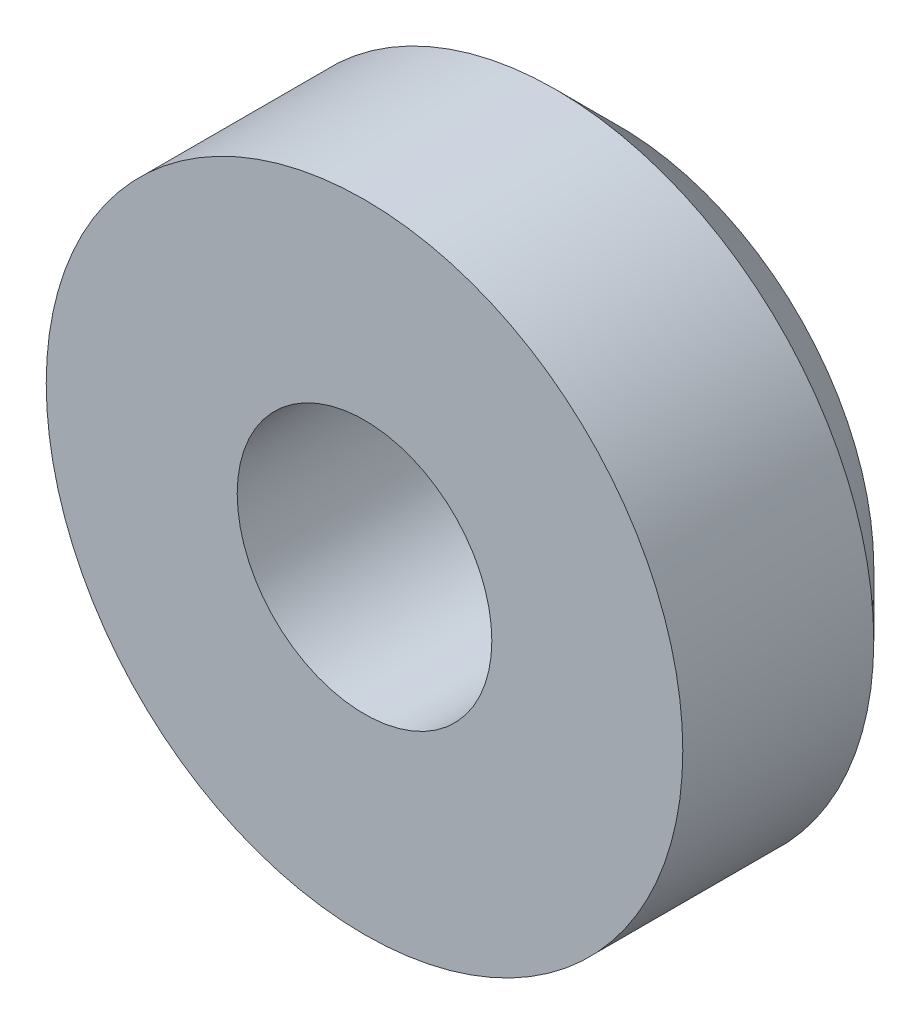
ISO-10303-21;
HEADER;
FILE_DESCRIPTION(('STEP AP214'),'2;1');
FILE_NAME('part.step','',(''),(''),'','','');
FILE_SCHEMA(('AUTOMOTIVE_DESIGN { 1 0 10303 214 1 1 1 1 }'));
ENDSEC;
DATA;
#1=APPLICATION_CONTEXT('core data for automotive mechanical design processes');
#2=APPLICATION_PROTOCOL_DEFINITION('international standard','automotive_design',2000,#1);
#3=PRODUCT_CONTEXT('',#1,'mechanical');
#4=PRODUCT('Part','Part','',(#3));
#5=PRODUCT_RELATED_PRODUCT_CATEGORY('part','',(#4));
#6=PRODUCT_DEFINITION_FORMATION('','',#4);
#7=PRODUCT_DEFINITION_CONTEXT('part definition',#1,'design');
#8=PRODUCT_DEFINITION('design','',#6,#7);
#9=PRODUCT_DEFINITION_SHAPE('','',#8);
#10=(LENGTH_UNIT() NAMED_UNIT(*) SI_UNIT(.MILLI.,.METRE.));
#11=(NAMED_UNIT(*) PLANE_ANGLE_UNIT() SI_UNIT($,.RADIAN.));
#12=(NAMED_UNIT(*) SI_UNIT($,.STERADIAN.) SOLID_ANGLE_UNIT());
#13=UNCERTAINTY_MEASURE_WITH_UNIT(LENGTH_MEASURE(1.E-05),#10,'distance_accuracy_value','');
#14=(GEOMETRIC_REPRESENTATION_CONTEXT(3) GLOBAL_UNCERTAINTY_ASSIGNED_CONTEXT((#13)) GLOBAL_UNIT_ASSIGNED_CONTEXT((#10,
#11,#12)) REPRESENTATION_CONTEXT('',''));
#15=CARTESIAN_POINT('',(0.,0.,0.));
#16=DIRECTION('',(0.,0.,1.));
#17=DIRECTION('',(1.,0.,0.));
#18=AXIS2_PLACEMENT_3D('',#15,#16,#17);
#19=CARTESIAN_POINT('',(0.,0.,2.));
#20=DIRECTION('',(0.,0.,-1.));
#21=DIRECTION('',(-1.,0.,0.));
#22=AXIS2_PLACEMENT_3D('',#19,#20,#21);
#23=CYLINDRICAL_SURFACE('',#22,15.);
#24=CARTESIAN_POINT('',(0.,0.,3.));
#25=DIRECTION('',(0.,0.,1.));
#26=DIRECTION('',(1.,0.,0.));
#27=AXIS2_PLACEMENT_3D('',#24,#25,#26);
#28=CIRCLE('',#27,15.);
#29=CARTESIAN_POINT('',(15.,0.,3.));
#30=VERTEX_POINT('',#29);
#31=EDGE_CURVE('E41',#30,#30,#28,.T.);
#32=ORIENTED_EDGE('',*,*,#31,.T.);
#33=EDGE_LOOP('',(#32));
#34=FACE_BOUND('',#33,.T.);
#35=CARTESIAN_POINT('',(0.,0.,12.));
#36=DIRECTION('',(0.,0.,1.));
#37=DIRECTION('',(1.,0.,0.));
#38=AXIS2_PLACEMENT_3D('',#35,#36,#37);
#39=CIRCLE('',#38,15.);
#40=CARTESIAN_POINT('',(15.,0.,12.));
#41=VERTEX_POINT('',#40);
#42=EDGE_CURVE('E49',#41,#41,#39,.T.);
#43=ORIENTED_EDGE('',*,*,#42,.F.);
#44=EDGE_LOOP('',(#43));
#45=FACE_BOUND('',#44,.T.);
#46=ADVANCED_FACE('F33',(#34,#45),#23,.T.);
#47=CARTESIAN_POINT('',(0.,0.,0.));
#48=DIRECTION('',(0.,0.,1.));
#49=DIRECTION('',(1.,0.,0.));
#50=AXIS2_PLACEMENT_3D('',#47,#48,#49);
#51=PLANE('',#50);
#52=CARTESIAN_POINT('',(0.,0.,0.));
#53=DIRECTION('',(0.,0.,1.));
#54=DIRECTION('',(1.,0.,0.));
#55=AXIS2_PLACEMENT_3D('',#52,#53,#54);
#56=CIRCLE('',#55,12.);
#57=CARTESIAN_POINT('',(12.,0.,0.));
#58=VERTEX_POINT('',#57);
#59=EDGE_CURVE('E10',#58,#58,#56,.F.);
#60=ORIENTED_EDGE('',*,*,#59,.T.);
#61=EDGE_LOOP('',(#60));
#62=FACE_BOUND('',#61,.T.);
#63=ADVANCED_FACE('F63',(#62),#51,.F.);
#64=CARTESIAN_POINT('',(0.,0.,12.));
#65=DIRECTION('',(0.,0.,1.));
#66=DIRECTION('',(1.,0.,0.));
#67=AXIS2_PLACEMENT_3D('',#64,#65,#66);
#68=PLANE('',#67);
#69=ORIENTED_EDGE('',*,*,#42,.T.);
#70=EDGE_LOOP('',(#69));
#71=FACE_BOUND('',#70,.T.);
#72=CARTESIAN_POINT('',(0.,0.,12.));
#73=DIRECTION('',(0.,0.,1.));
#74=DIRECTION('',(1.,0.,0.));
#75=AXIS2_PLACEMENT_3D('',#72,#73,#74);
#76=CIRCLE('',#75,6.);
#77=CARTESIAN_POINT('',(6.,0.,12.));
#78=VERTEX_POINT('',#77);
#79=EDGE_CURVE('E54',#78,#78,#76,.T.);
#80=ORIENTED_EDGE('',*,*,#79,.F.);
#81=EDGE_LOOP('',(#80));
#82=FACE_BOUND('',#81,.T.);
#83=ADVANCED_FACE('F61',(#71,#82),#68,.T.);
#84=CARTESIAN_POINT('',(0.,0.,12.));
#85=DIRECTION('',(0.,0.,-1.));
#86=DIRECTION('',(-1.,0.,0.));
#87=AXIS2_PLACEMENT_3D('',#84,#85,#86);
#88=CYLINDRICAL_SURFACE('',#87,6.);
#89=ORIENTED_EDGE('',*,*,#79,.T.);
#90=EDGE_LOOP('',(#89));
#91=FACE_BOUND('',#90,.T.);
#92=CARTESIAN_POINT('',(0.,0.,2.));
#93=DIRECTION('',(0.,0.,1.));
#94=DIRECTION('',(1.,0.,0.));
#95=AXIS2_PLACEMENT_3D('',#92,#93,#94);
#96=CIRCLE('',#95,6.);
#97=CARTESIAN_POINT('',(6.,0.,2.));
#98=VERTEX_POINT('',#97);
#99=EDGE_CURVE('E45',#98,#98,#96,.F.);
#100=ORIENTED_EDGE('',*,*,#99,.T.);
#101=EDGE_LOOP('',(#100));
#102=FACE_BOUND('',#101,.T.);
#103=ADVANCED_FACE('F58',(#91,#102),#88,.F.);
#104=CARTESIAN_POINT('',(0.,0.,2.));
#105=DIRECTION('',(0.,0.,1.));
#106=DIRECTION('',(1.,0.,0.));
#107=AXIS2_PLACEMENT_3D('',#104,#105,#106);
#108=PLANE('',#107);
#109=ORIENTED_EDGE('',*,*,#99,.F.);
#110=EDGE_LOOP('',(#109));
#111=FACE_BOUND('',#110,.T.);
#112=ADVANCED_FACE('F70',(#111),#108,.T.);
#113=CARTESIAN_POINT('',(0.,0.,3.));
#114=DIRECTION('',(0.,0.,1.));
#115=DIRECTION('',(1.,0.,0.));
#116=AXIS2_PLACEMENT_3D('',#113,#114,#115);
#117=CONICAL_SURFACE('',#116,15.,0.78539816339745);
#118=ORIENTED_EDGE('',*,*,#59,.F.);
#119=EDGE_LOOP('',(#118));
#120=FACE_BOUND('',#119,.T.);
#121=ORIENTED_EDGE('',*,*,#31,.F.);
#122=EDGE_LOOP('',(#121));
#123=FACE_BOUND('',#122,.T.);
#124=ADVANCED_FACE('F36',(#120,#123),#117,.T.);
#125=CLOSED_SHELL('',(#46,#63,#83,#103,#112,#124));
#126=MANIFOLD_SOLID_BREP('B2',#125);
#127=ADVANCED_BREP_SHAPE_REPRESENTATION('',(#18,#126),#14);
#128=SHAPE_DEFINITION_REPRESENTATION(#9,#127);
ENDSEC;
END-ISO-10303-21;
